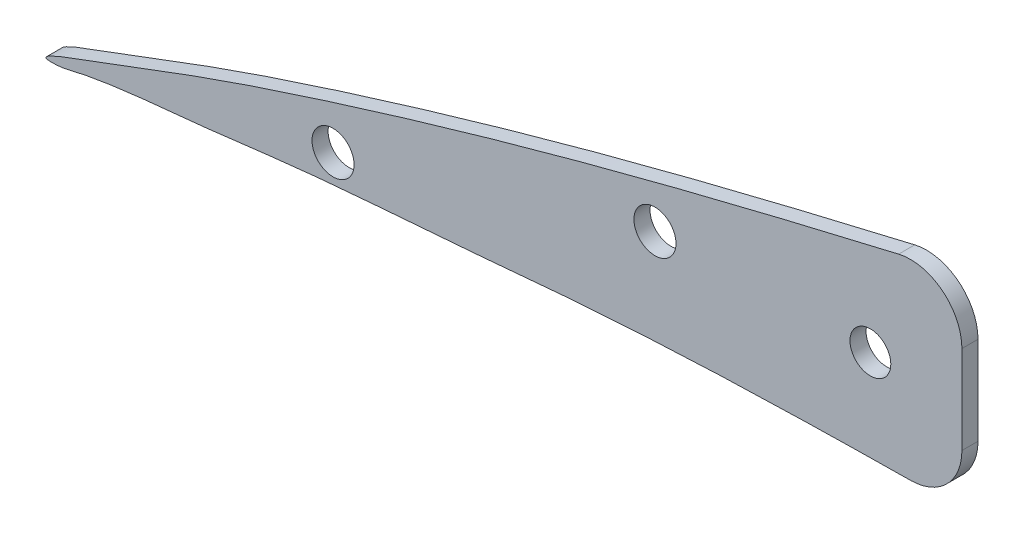
ISO-10303-21;
HEADER;
FILE_DESCRIPTION(('STEP AP214'),'2;1');
FILE_NAME('part.step','',(''),(''),'','','');
FILE_SCHEMA(('AUTOMOTIVE_DESIGN { 1 0 10303 214 1 1 1 1 }'));
ENDSEC;
DATA;
#1=APPLICATION_CONTEXT('core data for automotive mechanical design processes');
#2=APPLICATION_PROTOCOL_DEFINITION('international standard','automotive_design',2000,#1);
#3=PRODUCT_CONTEXT('',#1,'mechanical');
#4=PRODUCT('Part','Part','',(#3));
#5=PRODUCT_RELATED_PRODUCT_CATEGORY('part','',(#4));
#6=PRODUCT_DEFINITION_FORMATION('','',#4);
#7=PRODUCT_DEFINITION_CONTEXT('part definition',#1,'design');
#8=PRODUCT_DEFINITION('design','',#6,#7);
#9=PRODUCT_DEFINITION_SHAPE('','',#8);
#10=(LENGTH_UNIT() NAMED_UNIT(*) SI_UNIT(.MILLI.,.METRE.));
#11=(NAMED_UNIT(*) PLANE_ANGLE_UNIT() SI_UNIT($,.RADIAN.));
#12=(NAMED_UNIT(*) SI_UNIT($,.STERADIAN.) SOLID_ANGLE_UNIT());
#13=UNCERTAINTY_MEASURE_WITH_UNIT(LENGTH_MEASURE(1.E-05),#10,'distance_accuracy_value','');
#14=(GEOMETRIC_REPRESENTATION_CONTEXT(3) GLOBAL_UNCERTAINTY_ASSIGNED_CONTEXT((#13)) GLOBAL_UNIT_ASSIGNED_CONTEXT((#10,
#11,#12)) REPRESENTATION_CONTEXT('',''));
#15=CARTESIAN_POINT('',(0.,0.,0.));
#16=DIRECTION('',(0.,0.,1.));
#17=DIRECTION('',(1.,0.,0.));
#18=AXIS2_PLACEMENT_3D('',#15,#16,#17);
#19=CARTESIAN_POINT('',(99.3263908498514,18.4043947955345,226.06));
#20=CARTESIAN_POINT('',(77.8897663550013,13.4600133742419,226.06));
#21=CARTESIAN_POINT('',(52.9151511310183,7.64591830417928,226.06));
#22=CARTESIAN_POINT('',(19.7236271376638,-3.09277748737412,226.06));
#23=CARTESIAN_POINT('',(11.5033281919687,-6.35349465458856,226.06));
#24=CARTESIAN_POINT('',(1.30453703308477,-10.0425234793443,226.06));
#25=CARTESIAN_POINT('',(5.04760380641423,-9.65371338433422,226.06));
#26=B_SPLINE_CURVE_WITH_KNOTS('',3,(#19,#20,#21,#22,#23,#24,#25),.UNSPECIFIED.,.F.,.F.,(4,1,1,1,
4),(0.,0.630725310694853,0.824213609270468,0.940085476785923,1.),.UNSPECIFIED.);
#27=DIRECTION('',(0.,0.,-1.));
#28=VECTOR('',#27,1.);
#29=SURFACE_OF_LINEAR_EXTRUSION('',#26,#28);
#30=DIRECTION('',(0.,0.,-1.));
#31=VECTOR('',#30,1.);
#32=CARTESIAN_POINT('',(5.04760380641422,-9.65371338433422,226.06));
#33=LINE('',#32,#31);
#34=CARTESIAN_POINT('',(5.04760380641423,-9.65371338433422,197.485));
#35=VERTEX_POINT('',#34);
#36=CARTESIAN_POINT('',(5.04760380641423,-9.65371338433422,195.8975));
#37=VERTEX_POINT('',#36);
#38=EDGE_CURVE('E94',#35,#37,#33,.T.);
#39=ORIENTED_EDGE('',*,*,#38,.F.);
#40=CARTESIAN_POINT('',(99.3263908498514,18.4043947955345,197.485));
#41=CARTESIAN_POINT('',(77.8897663550013,13.4600133742419,197.485));
#42=CARTESIAN_POINT('',(52.9151511310183,7.64591830417928,197.485));
#43=CARTESIAN_POINT('',(19.7236271376638,-3.09277748737412,197.485));
#44=CARTESIAN_POINT('',(11.5033281919687,-6.35349465458856,197.485));
#45=CARTESIAN_POINT('',(1.30453703308477,-10.0425234793443,197.485));
#46=CARTESIAN_POINT('',(5.04760380641423,-9.65371338433422,197.485));
#47=B_SPLINE_CURVE_WITH_KNOTS('',3,(#40,#41,#42,#43,#44,#45,#46),.UNSPECIFIED.,.F.,.F.,(4,1,1,1,
4),(0.,0.630725310694853,0.824213609270468,0.940085476785923,1.),.UNSPECIFIED.);
#48=CARTESIAN_POINT('',(87.5011919550586,15.6626739204699,197.485));
#49=VERTEX_POINT('',#48);
#50=EDGE_CURVE('E102',#35,#49,#47,.F.);
#51=ORIENTED_EDGE('',*,*,#50,.T.);
#52=DIRECTION('',(0.,0.,-1.));
#53=VECTOR('',#52,1.);
#54=CARTESIAN_POINT('',(87.5011919550566,15.6626739204695,197.485));
#55=LINE('',#54,#53);
#56=CARTESIAN_POINT('',(87.5011919550566,15.6626739204695,195.8975));
#57=VERTEX_POINT('',#56);
#58=EDGE_CURVE('E127',#49,#57,#55,.T.);
#59=ORIENTED_EDGE('',*,*,#58,.T.);
#60=CARTESIAN_POINT('',(99.3263908498514,18.4043947955345,195.8975));
#61=CARTESIAN_POINT('',(77.8897663550013,13.4600133742419,195.8975));
#62=CARTESIAN_POINT('',(52.9151511310183,7.64591830417928,195.8975));
#63=CARTESIAN_POINT('',(19.7236271376638,-3.09277748737412,195.8975));
#64=CARTESIAN_POINT('',(11.5033281919687,-6.35349465458856,195.8975));
#65=CARTESIAN_POINT('',(1.30453703308477,-10.0425234793443,195.8975));
#66=CARTESIAN_POINT('',(5.04760380641423,-9.65371338433422,195.8975));
#67=B_SPLINE_CURVE_WITH_KNOTS('',3,(#60,#61,#62,#63,#64,#65,#66),.UNSPECIFIED.,.F.,.F.,(4,1,1,1,
4),(0.,0.630725310694853,0.824213609270468,0.940085476785923,1.),.UNSPECIFIED.);
#68=EDGE_CURVE('E56',#37,#57,#67,.F.);
#69=ORIENTED_EDGE('',*,*,#68,.F.);
#70=EDGE_LOOP('',(#39,#51,#59,#69));
#71=FACE_BOUND('',#70,.T.);
#72=ADVANCED_FACE('F39',(#71),#29,.F.);
#73=CARTESIAN_POINT('',(5.04760380641422,-9.65371338433422,226.06));
#74=CARTESIAN_POINT('',(9.48264965722818,-8.54612848277926,226.06));
#75=CARTESIAN_POINT('',(16.9884837285861,-8.07690609070966,226.06));
#76=CARTESIAN_POINT('',(30.336595099415,-6.25441019175279,226.06));
#77=CARTESIAN_POINT('',(41.9466597022993,-5.5660373440401,226.06));
#78=CARTESIAN_POINT('',(65.865842143348,-3.23134214309362,226.06));
#79=CARTESIAN_POINT('',(83.9748117251693,-3.08908655713665,226.06));
#80=CARTESIAN_POINT('',(99.3263908498514,-2.98644886203341,226.06));
#81=B_SPLINE_CURVE_WITH_KNOTS('',3,(#73,#74,#75,#76,#77,#78,#79,#80),.UNSPECIFIED.,.F.,.F.,(4,1,
1,1,1,4),(0.,0.144322392153104,0.23794765175378,0.427122749709389,0.512831912207282,1.),.UNSPECIFIED.);
#82=DIRECTION('',(0.,0.,-1.));
#83=VECTOR('',#82,1.);
#84=SURFACE_OF_LINEAR_EXTRUSION('',#81,#83);
#85=CARTESIAN_POINT('',(5.04760380641422,-9.65371338433422,197.485));
#86=CARTESIAN_POINT('',(9.48264965722818,-8.54612848277926,197.485));
#87=CARTESIAN_POINT('',(16.9884837285861,-8.07690609070966,197.485));
#88=CARTESIAN_POINT('',(30.336595099415,-6.25441019175279,197.485));
#89=CARTESIAN_POINT('',(41.9466597022993,-5.5660373440401,197.485));
#90=CARTESIAN_POINT('',(65.865842143348,-3.23134214309362,197.485));
#91=CARTESIAN_POINT('',(83.9748117251693,-3.08908655713665,197.485));
#92=CARTESIAN_POINT('',(99.3263908498514,-2.98644886203341,197.485));
#93=B_SPLINE_CURVE_WITH_KNOTS('',3,(#85,#86,#87,#88,#89,#90,#91,#92),.UNSPECIFIED.,.F.,.F.,(4,1,
1,1,1,4),(0.,0.144322392153104,0.23794765175378,0.427122749709389,0.512831912207282,1.),.UNSPECIFIED.);
#94=CARTESIAN_POINT('',(88.7152353159575,-3.07428804949461,197.485));
#95=VERTEX_POINT('',#94);
#96=EDGE_CURVE('E89',#95,#35,#93,.F.);
#97=ORIENTED_EDGE('',*,*,#96,.T.);
#98=ORIENTED_EDGE('',*,*,#38,.T.);
#99=CARTESIAN_POINT('',(5.04760380641422,-9.65371338433422,195.8975));
#100=CARTESIAN_POINT('',(9.48264965722818,-8.54612848277926,195.8975));
#101=CARTESIAN_POINT('',(16.9884837285861,-8.07690609070966,195.8975));
#102=CARTESIAN_POINT('',(30.336595099415,-6.25441019175279,195.8975));
#103=CARTESIAN_POINT('',(41.9466597022993,-5.5660373440401,195.8975));
#104=CARTESIAN_POINT('',(65.865842143348,-3.23134214309362,195.8975));
#105=CARTESIAN_POINT('',(83.9748117251693,-3.08908655713665,195.8975));
#106=CARTESIAN_POINT('',(99.3263908498514,-2.98644886203341,195.8975));
#107=B_SPLINE_CURVE_WITH_KNOTS('',3,(#99,#100,#101,#102,#103,#104,#105,#106),.UNSPECIFIED.,.F.,
.F.,(4,1,1,1,1,4),(0.,0.144322392153104,0.23794765175378,0.427122749709389,0.512831912207282,
1.),.UNSPECIFIED.);
#108=CARTESIAN_POINT('',(88.7152353159575,-3.07428804949461,195.8975));
#109=VERTEX_POINT('',#108);
#110=EDGE_CURVE('E147',#109,#37,#107,.F.);
#111=ORIENTED_EDGE('',*,*,#110,.F.);
#112=DIRECTION('',(0.,0.,-1.));
#113=VECTOR('',#112,1.);
#114=CARTESIAN_POINT('',(88.7152353159575,-3.07428804949461,28.5750000000001));
#115=LINE('',#114,#113);
#116=EDGE_CURVE('E96',#109,#95,#115,.F.);
#117=ORIENTED_EDGE('',*,*,#116,.T.);
#118=EDGE_LOOP('',(#97,#98,#111,#117));
#119=FACE_BOUND('',#118,.T.);
#120=ADVANCED_FACE('F91',(#119),#84,.F.);
#121=CARTESIAN_POINT('',(93.7383908498514,-9.84811843183929,197.485));
#122=DIRECTION('',(-1.,0.,0.));
#123=DIRECTION('',(0.,0.,1.));
#124=AXIS2_PLACEMENT_3D('',#121,#122,#123);
#125=PLANE('',#124);
#126=DIRECTION('',(0.,-1.,0.));
#127=VECTOR('',#126,1.);
#128=CARTESIAN_POINT('',(93.7383908498514,42.1008624440534,195.8975));
#129=LINE('',#128,#127);
#130=CARTESIAN_POINT('',(93.7383908498514,10.7162316921719,195.8975));
#131=VERTEX_POINT('',#130);
#132=CARTESIAN_POINT('',(93.7383908498514,2.00539389986729,195.8975));
#133=VERTEX_POINT('',#132);
#134=EDGE_CURVE('E141',#131,#133,#129,.T.);
#135=ORIENTED_EDGE('',*,*,#134,.F.);
#136=DIRECTION('',(0.,0.,-1.));
#137=VECTOR('',#136,1.);
#138=CARTESIAN_POINT('',(93.7383908498514,10.7162316921719,197.485));
#139=LINE('',#138,#137);
#140=CARTESIAN_POINT('',(93.7383908498514,10.7162316921719,197.485));
#141=VERTEX_POINT('',#140);
#142=EDGE_CURVE('E63',#131,#141,#139,.F.);
#143=ORIENTED_EDGE('',*,*,#142,.T.);
#144=DIRECTION('',(0.,1.,0.));
#145=VECTOR('',#144,1.);
#146=CARTESIAN_POINT('',(93.7383908498514,-9.84811843183929,197.485));
#147=LINE('',#146,#145);
#148=CARTESIAN_POINT('',(93.7383908498514,2.00539389986729,197.485));
#149=VERTEX_POINT('',#148);
#150=EDGE_CURVE('E110',#149,#141,#147,.T.);
#151=ORIENTED_EDGE('',*,*,#150,.F.);
#152=DIRECTION('',(0.,0.,-1.));
#153=VECTOR('',#152,1.);
#154=CARTESIAN_POINT('',(93.7383908498514,2.00539389986729,197.485));
#155=LINE('',#154,#153);
#156=EDGE_CURVE('E49',#149,#133,#155,.T.);
#157=ORIENTED_EDGE('',*,*,#156,.T.);
#158=EDGE_LOOP('',(#135,#143,#151,#157));
#159=FACE_BOUND('',#158,.T.);
#160=ADVANCED_FACE('F140',(#159),#125,.F.);
#161=CARTESIAN_POINT('',(88.6583908498514,2.00539389986729,113.03));
#162=DIRECTION('',(0.,0.,-1.));
#163=DIRECTION('',(-1.,0.,0.));
#164=AXIS2_PLACEMENT_3D('',#161,#162,#163);
#165=CYLINDRICAL_SURFACE('',#164,5.08);
#166=ORIENTED_EDGE('',*,*,#116,.F.);
#167=CARTESIAN_POINT('',(88.6583908498514,2.00539389986729,195.8975));
#168=DIRECTION('',(0.,0.,-1.));
#169=DIRECTION('',(-1.,0.,0.));
#170=AXIS2_PLACEMENT_3D('',#167,#168,#169);
#171=CIRCLE('',#170,5.08);
#172=EDGE_CURVE('E145',#109,#133,#171,.F.);
#173=ORIENTED_EDGE('',*,*,#172,.T.);
#174=ORIENTED_EDGE('',*,*,#156,.F.);
#175=CARTESIAN_POINT('',(88.6583908498514,2.00539389986729,197.485));
#176=DIRECTION('',(0.,0.,-1.));
#177=DIRECTION('',(-1.,0.,0.));
#178=AXIS2_PLACEMENT_3D('',#175,#176,#177);
#179=CIRCLE('',#178,5.08);
#180=EDGE_CURVE('E132',#95,#149,#179,.F.);
#181=ORIENTED_EDGE('',*,*,#180,.F.);
#182=EDGE_LOOP('',(#166,#173,#174,#181));
#183=FACE_BOUND('',#182,.T.);
#184=ADVANCED_FACE('F144',(#183),#165,.T.);
#185=CARTESIAN_POINT('',(88.6583908498514,10.7162316921719,113.03));
#186=DIRECTION('',(0.,0.,-1.));
#187=DIRECTION('',(-1.,0.,0.));
#188=AXIS2_PLACEMENT_3D('',#185,#186,#187);
#189=CYLINDRICAL_SURFACE('',#188,5.08);
#190=ORIENTED_EDGE('',*,*,#142,.F.);
#191=CARTESIAN_POINT('',(88.6583908498514,10.7162316921719,195.8975));
#192=DIRECTION('',(0.,0.,-1.));
#193=DIRECTION('',(-1.,0.,0.));
#194=AXIS2_PLACEMENT_3D('',#191,#192,#193);
#195=CIRCLE('',#194,5.08);
#196=EDGE_CURVE('E11',#131,#57,#195,.F.);
#197=ORIENTED_EDGE('',*,*,#196,.T.);
#198=ORIENTED_EDGE('',*,*,#58,.F.);
#199=CARTESIAN_POINT('',(88.6583908498514,10.7162316921719,197.485));
#200=DIRECTION('',(0.,0.,-1.));
#201=DIRECTION('',(-1.,0.,0.));
#202=AXIS2_PLACEMENT_3D('',#199,#200,#201);
#203=CIRCLE('',#202,5.08);
#204=EDGE_CURVE('E105',#141,#49,#203,.F.);
#205=ORIENTED_EDGE('',*,*,#204,.F.);
#206=EDGE_LOOP('',(#190,#197,#198,#205));
#207=FACE_BOUND('',#206,.T.);
#208=ADVANCED_FACE('F41',(#207),#189,.T.);
#209=CARTESIAN_POINT('',(73.1643908498514,-9.84811843183929,197.485));
#210=DIRECTION('',(0.,0.,-1.));
#211=DIRECTION('',(-1.,0.,0.));
#212=AXIS2_PLACEMENT_3D('',#209,#210,#211);
#213=PLANE('',#212);
#214=CARTESIAN_POINT('',(31.7176038064142,-3.55771338433423,197.485));
#215=DIRECTION('',(0.,0.,1.));
#216=DIRECTION('',(1.,0.,0.));
#217=AXIS2_PLACEMENT_3D('',#214,#215,#216);
#218=CIRCLE('',#217,2.075);
#219=CARTESIAN_POINT('',(33.7926038064142,-3.55771338433423,197.485));
#220=VERTEX_POINT('',#219);
#221=EDGE_CURVE('E207',#220,#220,#218,.T.);
#222=ORIENTED_EDGE('',*,*,#221,.F.);
#223=EDGE_LOOP('',(#222));
#224=FACE_BOUND('',#223,.T.);
#225=CARTESIAN_POINT('',(63.4676038064142,5.58628661566577,197.485));
#226=DIRECTION('',(0.,0.,1.));
#227=DIRECTION('',(1.,0.,0.));
#228=AXIS2_PLACEMENT_3D('',#225,#226,#227);
#229=CIRCLE('',#228,2.07499999999999);
#230=CARTESIAN_POINT('',(65.5426038064142,5.58628661566577,197.485));
#231=VERTEX_POINT('',#230);
#232=EDGE_CURVE('E216',#231,#231,#229,.T.);
#233=ORIENTED_EDGE('',*,*,#232,.F.);
#234=EDGE_LOOP('',(#233));
#235=FACE_BOUND('',#234,.T.);
#236=CARTESIAN_POINT('',(84.7135630366474,5.87485485714576,197.485));
#237=DIRECTION('',(0.,0.,1.));
#238=DIRECTION('',(1.,0.,0.));
#239=AXIS2_PLACEMENT_3D('',#236,#237,#238);
#240=CIRCLE('',#239,2.01295);
#241=CARTESIAN_POINT('',(86.7265130366474,5.87485485714576,197.485));
#242=VERTEX_POINT('',#241);
#243=EDGE_CURVE('E213',#242,#242,#240,.T.);
#244=ORIENTED_EDGE('',*,*,#243,.F.);
#245=EDGE_LOOP('',(#244));
#246=FACE_BOUND('',#245,.T.);
#247=ORIENTED_EDGE('',*,*,#50,.F.);
#248=ORIENTED_EDGE('',*,*,#96,.F.);
#249=ORIENTED_EDGE('',*,*,#180,.T.);
#250=ORIENTED_EDGE('',*,*,#150,.T.);
#251=ORIENTED_EDGE('',*,*,#204,.T.);
#252=EDGE_LOOP('',(#247,#248,#249,#250,#251));
#253=FACE_BOUND('',#252,.T.);
#254=ADVANCED_FACE('F103',(#224,#235,#246,#253),#213,.F.);
#255=CARTESIAN_POINT('',(93.7383908498514,42.1008624440534,195.8975));
#256=DIRECTION('',(0.,0.,-1.));
#257=DIRECTION('',(-1.,0.,0.));
#258=AXIS2_PLACEMENT_3D('',#255,#256,#257);
#259=PLANE('',#258);
#260=CARTESIAN_POINT('',(31.7176038064142,-3.55771338433423,195.8975));
#261=DIRECTION('',(0.,0.,1.));
#262=DIRECTION('',(1.,0.,0.));
#263=AXIS2_PLACEMENT_3D('',#260,#261,#262);
#264=CIRCLE('',#263,2.075);
#265=CARTESIAN_POINT('',(33.7926038064142,-3.55771338433423,195.8975));
#266=VERTEX_POINT('',#265);
#267=EDGE_CURVE('E204',#266,#266,#264,.T.);
#268=ORIENTED_EDGE('',*,*,#267,.T.);
#269=EDGE_LOOP('',(#268));
#270=FACE_BOUND('',#269,.T.);
#271=CARTESIAN_POINT('',(63.4676038064142,5.58628661566577,195.8975));
#272=DIRECTION('',(0.,0.,1.));
#273=DIRECTION('',(1.,0.,0.));
#274=AXIS2_PLACEMENT_3D('',#271,#272,#273);
#275=CIRCLE('',#274,2.07499999999999);
#276=CARTESIAN_POINT('',(65.5426038064142,5.58628661566577,195.8975));
#277=VERTEX_POINT('',#276);
#278=EDGE_CURVE('E209',#277,#277,#275,.T.);
#279=ORIENTED_EDGE('',*,*,#278,.T.);
#280=EDGE_LOOP('',(#279));
#281=FACE_BOUND('',#280,.T.);
#282=CARTESIAN_POINT('',(84.7135630366474,5.87485485714576,195.8975));
#283=DIRECTION('',(0.,0.,-1.));
#284=DIRECTION('',(-1.,0.,0.));
#285=AXIS2_PLACEMENT_3D('',#282,#283,#284);
#286=CIRCLE('',#285,2.01295);
#287=CARTESIAN_POINT('',(82.7006130366474,5.87485485714576,195.8975));
#288=VERTEX_POINT('',#287);
#289=EDGE_CURVE('E43',#288,#288,#286,.F.);
#290=ORIENTED_EDGE('',*,*,#289,.T.);
#291=EDGE_LOOP('',(#290));
#292=FACE_BOUND('',#291,.T.);
#293=ORIENTED_EDGE('',*,*,#110,.T.);
#294=ORIENTED_EDGE('',*,*,#68,.T.);
#295=ORIENTED_EDGE('',*,*,#196,.F.);
#296=ORIENTED_EDGE('',*,*,#134,.T.);
#297=ORIENTED_EDGE('',*,*,#172,.F.);
#298=EDGE_LOOP('',(#293,#294,#295,#296,#297));
#299=FACE_BOUND('',#298,.T.);
#300=ADVANCED_FACE('F183',(#270,#281,#292,#299),#259,.T.);
#301=CARTESIAN_POINT('',(84.7135630366474,5.87485485714576,197.485));
#302=DIRECTION('',(0.,0.,-1.));
#303=DIRECTION('',(-1.,0.,0.));
#304=AXIS2_PLACEMENT_3D('',#301,#302,#303);
#305=CYLINDRICAL_SURFACE('',#304,2.01295);
#306=ORIENTED_EDGE('',*,*,#289,.F.);
#307=EDGE_LOOP('',(#306));
#308=FACE_BOUND('',#307,.T.);
#309=ORIENTED_EDGE('',*,*,#243,.T.);
#310=EDGE_LOOP('',(#309));
#311=FACE_BOUND('',#310,.T.);
#312=ADVANCED_FACE('F187',(#308,#311),#305,.F.);
#313=CARTESIAN_POINT('',(63.4676038064142,5.58628661566577,195.8975));
#314=DIRECTION('',(0.,0.,1.));
#315=DIRECTION('',(1.,0.,0.));
#316=AXIS2_PLACEMENT_3D('',#313,#314,#315);
#317=CYLINDRICAL_SURFACE('',#316,2.07499999999999);
#318=ORIENTED_EDGE('',*,*,#278,.F.);
#319=EDGE_LOOP('',(#318));
#320=FACE_BOUND('',#319,.T.);
#321=ORIENTED_EDGE('',*,*,#232,.T.);
#322=EDGE_LOOP('',(#321));
#323=FACE_BOUND('',#322,.T.);
#324=ADVANCED_FACE('F191',(#320,#323),#317,.F.);
#325=CARTESIAN_POINT('',(31.7176038064142,-3.55771338433423,195.8975));
#326=DIRECTION('',(0.,0.,1.));
#327=DIRECTION('',(1.,0.,0.));
#328=AXIS2_PLACEMENT_3D('',#325,#326,#327);
#329=CYLINDRICAL_SURFACE('',#328,2.075);
#330=ORIENTED_EDGE('',*,*,#267,.F.);
#331=EDGE_LOOP('',(#330));
#332=FACE_BOUND('',#331,.T.);
#333=ORIENTED_EDGE('',*,*,#221,.T.);
#334=EDGE_LOOP('',(#333));
#335=FACE_BOUND('',#334,.T.);
#336=ADVANCED_FACE('F195',(#332,#335),#329,.F.);
#337=CLOSED_SHELL('',(#72,#120,#160,#184,#208,#254,#300,#312,#324,#336));
#338=MANIFOLD_SOLID_BREP('B2',#337);
#339=ADVANCED_BREP_SHAPE_REPRESENTATION('',(#18,#338),#14);
#340=SHAPE_DEFINITION_REPRESENTATION(#9,#339);
ENDSEC;
END-ISO-10303-21;
